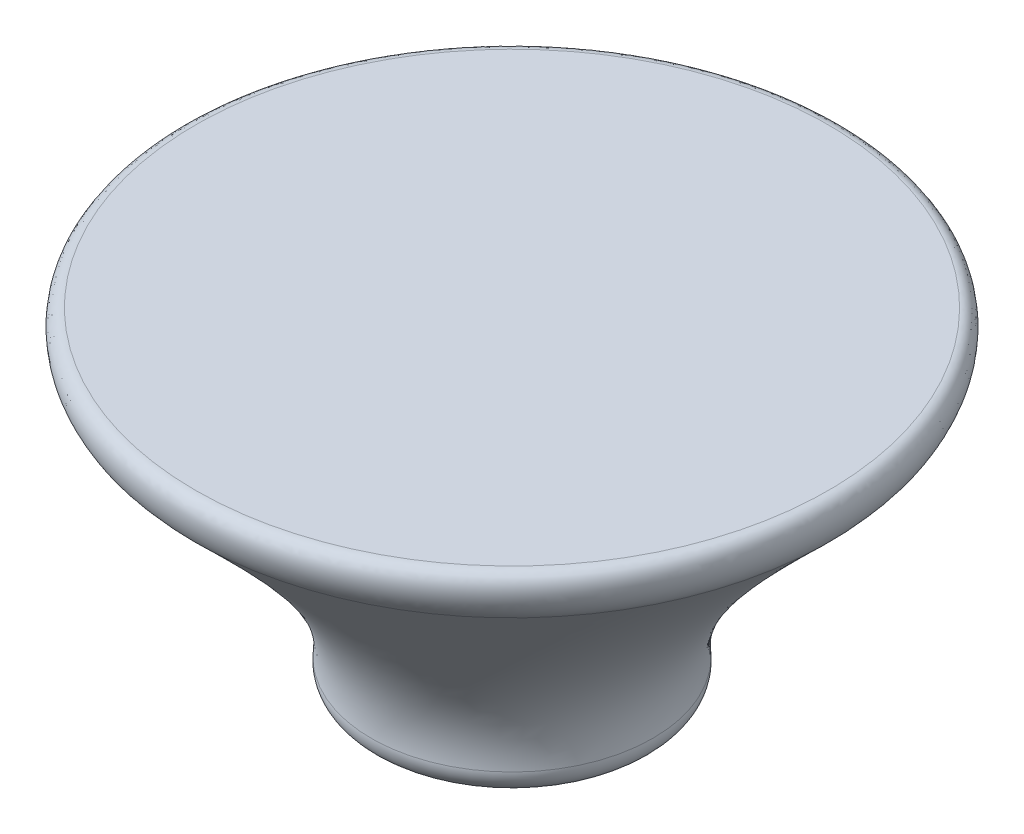
ISO-10303-21;
HEADER;
FILE_DESCRIPTION(('STEP AP214'),'2;1');
FILE_NAME('part.step','',(''),(''),'','','');
FILE_SCHEMA(('AUTOMOTIVE_DESIGN { 1 0 10303 214 1 1 1 1 }'));
ENDSEC;
DATA;
#1=APPLICATION_CONTEXT('core data for automotive mechanical design processes');
#2=APPLICATION_PROTOCOL_DEFINITION('international standard','automotive_design',2000,#1);
#3=PRODUCT_CONTEXT('',#1,'mechanical');
#4=PRODUCT('Part','Part','',(#3));
#5=PRODUCT_RELATED_PRODUCT_CATEGORY('part','',(#4));
#6=PRODUCT_DEFINITION_FORMATION('','',#4);
#7=PRODUCT_DEFINITION_CONTEXT('part definition',#1,'design');
#8=PRODUCT_DEFINITION('design','',#6,#7);
#9=PRODUCT_DEFINITION_SHAPE('','',#8);
#10=(LENGTH_UNIT() NAMED_UNIT(*) SI_UNIT(.MILLI.,.METRE.));
#11=(NAMED_UNIT(*) PLANE_ANGLE_UNIT() SI_UNIT($,.RADIAN.));
#12=(NAMED_UNIT(*) SI_UNIT($,.STERADIAN.) SOLID_ANGLE_UNIT());
#13=UNCERTAINTY_MEASURE_WITH_UNIT(LENGTH_MEASURE(1.E-05),#10,'distance_accuracy_value','');
#14=(GEOMETRIC_REPRESENTATION_CONTEXT(3) GLOBAL_UNCERTAINTY_ASSIGNED_CONTEXT((#13)) GLOBAL_UNIT_ASSIGNED_CONTEXT((#10,
#11,#12)) REPRESENTATION_CONTEXT('',''));
#15=CARTESIAN_POINT('',(0.,0.,0.));
#16=DIRECTION('',(0.,0.,1.));
#17=DIRECTION('',(1.,0.,0.));
#18=AXIS2_PLACEMENT_3D('',#15,#16,#17);
#19=CARTESIAN_POINT('',(0.,0.,0.));
#20=DIRECTION('',(0.,1.,0.));
#21=DIRECTION('',(0.,0.,1.));
#22=AXIS2_PLACEMENT_3D('',#19,#20,#21);
#23=PLANE('',#22);
#24=CARTESIAN_POINT('',(0.,0.,0.));
#25=DIRECTION('',(0.,1.,0.));
#26=DIRECTION('',(0.,0.,1.));
#27=AXIS2_PLACEMENT_3D('',#24,#25,#26);
#28=CIRCLE('',#27,5.46471682788271);
#29=CARTESIAN_POINT('',(0.,0.,5.46471682788271));
#30=VERTEX_POINT('',#29);
#31=EDGE_CURVE('E12',#30,#30,#28,.F.);
#32=ORIENTED_EDGE('',*,*,#31,.T.);
#33=EDGE_LOOP('',(#32));
#34=FACE_BOUND('',#33,.T.);
#35=CARTESIAN_POINT('',(0.,0.,0.));
#36=DIRECTION('',(0.,1.,0.));
#37=DIRECTION('',(0.,0.,1.));
#38=AXIS2_PLACEMENT_3D('',#35,#36,#37);
#39=CIRCLE('',#38,1.7);
#40=CARTESIAN_POINT('',(0.,0.,1.7));
#41=VERTEX_POINT('',#40);
#42=EDGE_CURVE('E161',#41,#41,#39,.T.);
#43=ORIENTED_EDGE('',*,*,#42,.T.);
#44=EDGE_LOOP('',(#43));
#45=FACE_BOUND('',#44,.T.);
#46=ADVANCED_FACE('F51',(#34,#45),#23,.F.);
#47=CARTESIAN_POINT('',(0.,15.,0.));
#48=DIRECTION('',(0.,1.,0.));
#49=DIRECTION('',(0.,0.,1.));
#50=AXIS2_PLACEMENT_3D('',#47,#48,#49);
#51=PLANE('',#50);
#52=CARTESIAN_POINT('',(0.,15.,14.5271494186596));
#53=CARTESIAN_POINT('',(-0.950799705315711,15.,14.5271494186588));
#54=CARTESIAN_POINT('',(-1.90157590247675,15.,14.4335061367227));
#55=CARTESIAN_POINT('',(-3.76663661364865,15.,14.0625224953567));
#56=CARTESIAN_POINT('',(-4.68087501475208,15.,13.7851913083565));
#57=CARTESIAN_POINT('',(-6.43772378927421,15.,13.0574807189092));
#58=CARTESIAN_POINT('',(-7.28029072527508,15.,12.6071193088302));
#59=CARTESIAN_POINT('',(-8.86141284999548,15.,11.5506472811578));
#60=CARTESIAN_POINT('',(-9.59992894606577,15.,10.9445627844222));
#61=CARTESIAN_POINT('',(-10.944562784423,15.,9.59992894606664));
#62=CARTESIAN_POINT('',(-11.5506472811545,15.,8.86141284999383));
#63=CARTESIAN_POINT('',(-12.6071193088335,15.,7.28029072527673));
#64=CARTESIAN_POINT('',(-13.0574807189091,15.,6.43772378927632));
#65=CARTESIAN_POINT('',(-13.7851913083565,15.,4.68087501475006));
#66=CARTESIAN_POINT('',(-14.0625224953542,15.,3.76663661364887));
#67=CARTESIAN_POINT('',(-14.4335061367251,15.,1.90157590247656));
#68=CARTESIAN_POINT('',(-14.5271494186588,15.,0.950799705321582));
#69=CARTESIAN_POINT('',(-14.5271494186604,15.,-0.950799705321645));
#70=CARTESIAN_POINT('',(-14.433506136726,15.,-1.90157590247984));
#71=CARTESIAN_POINT('',(-14.0625224953534,15.,-3.76663661364556));
#72=CARTESIAN_POINT('',(-13.7851913083565,15.,-4.68087501475455));
#73=CARTESIAN_POINT('',(-13.0574807189092,15.,-6.43772378927174));
#74=CARTESIAN_POINT('',(-12.6071193088311,15.,-7.2802907252792));
#75=CARTESIAN_POINT('',(-11.550647281157,15.,-8.86141284999135));
#76=CARTESIAN_POINT('',(-10.944562784423,15.,-9.59992894606498));
#77=CARTESIAN_POINT('',(-9.59992894606578,15.,-10.9445627844238));
#78=CARTESIAN_POINT('',(-8.86141284999384,15.,-11.5506472811578));
#79=CARTESIAN_POINT('',(-7.28029072527674,15.,-12.6071193088302));
#80=CARTESIAN_POINT('',(-6.43772378927549,15.,-13.0574807189083));
#81=CARTESIAN_POINT('',(-4.68087501475088,15.,-13.7851913083573));
#82=CARTESIAN_POINT('',(-3.76663661365012,15.,-14.0625224953558));
#83=CARTESIAN_POINT('',(-1.90157590247533,15.,-14.4335061367235));
#84=CARTESIAN_POINT('',(-0.950799705317287,15.,-14.5271494186612));
#85=CARTESIAN_POINT('',(0.950799705317283,15.,-14.5271494186579));
#86=CARTESIAN_POINT('',(1.90157590247675,15.,-14.4335061367227));
#87=CARTESIAN_POINT('',(3.76663661364865,15.,-14.0625224953567));
#88=CARTESIAN_POINT('',(4.68087501475252,15.,-13.785191308354));
#89=CARTESIAN_POINT('',(6.43772378927383,15.,-13.0574807189116));
#90=CARTESIAN_POINT('',(7.28029072527718,15.,-12.6071193088368));
#91=CARTESIAN_POINT('',(8.86141284999338,15.,-11.5506472811513));
#92=CARTESIAN_POINT('',(9.59992894606029,15.,-10.9445627844277));
#93=CARTESIAN_POINT('',(10.9445627844285,15.,-9.5999289460611));
#94=CARTESIAN_POINT('',(11.5506472811562,15.,-8.86141284999091));
#95=CARTESIAN_POINT('',(12.6071193088319,15.,-7.28029072527966));
#96=CARTESIAN_POINT('',(13.0574807189095,15.,-6.43772378927311));
#97=CARTESIAN_POINT('',(13.7851913083562,15.,-4.68087501475322));
#98=CARTESIAN_POINT('',(14.0625224953569,15.,-3.76663661364857));
#99=CARTESIAN_POINT('',(14.4335061367224,15.,-1.90157590247686));
#100=CARTESIAN_POINT('',(14.5271494186612,15.,-0.950799705316647));
#101=CARTESIAN_POINT('',(14.5271494186579,15.,0.950799705316648));
#102=CARTESIAN_POINT('',(14.4335061367224,15.,1.90157590247499));
#103=CARTESIAN_POINT('',(14.0625224953569,15.,3.76663661365041));
#104=CARTESIAN_POINT('',(13.785191308357,15.,4.68087501475404));
#105=CARTESIAN_POINT('',(13.0574807189086,15.,6.43772378927229));
#106=CARTESIAN_POINT('',(12.6071193088343,15.,7.28029072527883));
#107=CARTESIAN_POINT('',(11.5506472811537,15.,8.86141284999173));
#108=CARTESIAN_POINT('',(10.9445627844244,15.,9.5999289460644));
#109=CARTESIAN_POINT('',(9.5999289460644,15.,10.9445627844244));
#110=CARTESIAN_POINT('',(8.86141284999338,15.,11.5506472811554));
#111=CARTESIAN_POINT('',(7.28029072527718,15.,12.6071193088327));
#112=CARTESIAN_POINT('',(6.43772378927382,15.,13.0574807189083));
#113=CARTESIAN_POINT('',(4.68087501475251,15.,13.7851913083573));
#114=CARTESIAN_POINT('',(3.76663661364806,15.,14.062522495355));
#115=CARTESIAN_POINT('',(1.90157590247739,15.,14.4335061367243));
#116=CARTESIAN_POINT('',(0.950799705315712,15.,14.5271494186604));
#117=CARTESIAN_POINT('',(0.,15.,14.5271494186596));
#118=(BOUNDED_CURVE() B_SPLINE_CURVE(3,(#52,#53,#54,#55,#56,#57,#58,#59,#60,#61,#62,#63,#64,#65,
#66,#67,#68,#69,#70,#71,#72,#73,#74,#75,#76,#77,#78,#79,#80,#81,#82,#83,#84,#85,#86,#87,#88,#89,
#90,#91,#92,#93,#94,#95,#96,#97,#98,#99,#100,#101,#102,#103,#104,#105,#106,#107,#108,#109,#110,
#111,#112,#113,#114,#115,#116,#117),.UNSPECIFIED.,.T.,.F.) B_SPLINE_CURVE_WITH_KNOTS((4,2,2,2,2,
2,2,2,2,2,2,2,2,2,2,2,2,2,2,2,2,2,2,2,2,2,2,2,2,2,2,2,4),(-4.71238898038469,-4.51603943953533,
-4.31968989868597,-4.1233403578366,-3.92699081698724,-3.73064127613788,-3.53429173528852,
-3.33794219443916,-3.14159265358979,-2.94524311274043,-2.74889357189107,-2.55254403104171,
-2.35619449019234,-2.15984494934298,-1.96349540849362,-1.76714586764426,-1.5707963267949,
-1.37444678594553,-1.17809724509617,-0.98174770424681,-0.785398163397448,-0.589048622548086,
-0.392699081698724,-0.196349540849362,0.,0.196349540849362,0.392699081698724,0.589048622548086,
0.785398163397448,0.98174770424681,1.17809724509617,1.37444678594553,1.5707963267949),
.UNSPECIFIED.) CURVE() GEOMETRIC_REPRESENTATION_ITEM() RATIONAL_B_SPLINE_CURVE((1.,1.,1.,1.,1.,
1.,1.,1.,1.,1.,1.,1.,1.,1.,1.,1.,1.,1.,1.,1.,1.,1.,1.,1.,1.,1.,1.,1.,1.,1.,1.,1.,1.,1.,1.,1.,1.,
1.,1.,1.,1.,1.,1.,1.,1.,1.,1.,1.,1.,1.,1.,1.,1.,1.,1.,1.,1.,1.,1.,1.,1.,1.,1.,1.,1.,1.)) REPRESENTATION_ITEM(''));
#119=CARTESIAN_POINT('',(0.,15.,14.5271494186596));
#120=VERTEX_POINT('',#119);
#121=EDGE_CURVE('E68',#120,#120,#118,.F.);
#122=ORIENTED_EDGE('',*,*,#121,.T.);
#123=EDGE_LOOP('',(#122));
#124=FACE_BOUND('',#123,.T.);
#125=ADVANCED_FACE('F141',(#124),#51,.T.);
#126=CARTESIAN_POINT('',(-3.90873980544479,15.,-16.2361249420338));
#127=CARTESIAN_POINT('',(6.30065173641158,0.,-2.27854947202243));
#128=CARTESIAN_POINT('',(28.5635100786228,15.,-24.0536045529234));
#129=CARTESIAN_POINT('',(10.8577506804565,0.,10.3227540008007));
#130=CARTESIAN_POINT('',(36.3809896895123,15.,8.4186453311442));
#131=CARTESIAN_POINT('',(-1.74355279236672,0.,14.8798529448456));
#132=CARTESIAN_POINT('',(3.90873980544479,15.,16.2361249420338));
#133=CARTESIAN_POINT('',(-6.30065173641158,0.,2.27854947202243));
#134=CARTESIAN_POINT('',(-28.5635100786227,15.,24.0536045529233));
#135=CARTESIAN_POINT('',(-10.8577506804565,0.,-10.3227540008007));
#136=CARTESIAN_POINT('',(-36.3809896895123,15.,-8.41864533114418));
#137=CARTESIAN_POINT('',(1.74355279236671,0.,-14.8798529448456));
#138=CARTESIAN_POINT('',(-3.90873980544479,15.,-16.2361249420338));
#139=CARTESIAN_POINT('',(6.30065173641158,0.,-2.27854947202243));
#140=(BOUNDED_SURFACE() B_SPLINE_SURFACE(3,1,((#126,#127),(#128,#129),(#130,#131),(#132,#133),
(#134,#135),(#136,#137),(#138,#139)),.UNSPECIFIED.,.T.,.F.,.F.) B_SPLINE_SURFACE_WITH_KNOTS((4,
3,4),(2,2),(0.,0.5,1.),(0.,1.),
.UNSPECIFIED.) GEOMETRIC_REPRESENTATION_ITEM() RATIONAL_B_SPLINE_SURFACE(((1.,1.),
(0.333333333333333,0.333333333333333),(0.333333333333333,0.333333333333333),(1.,1.),
(0.333333333333334,0.333333333333333),(0.333333333333334,0.333333333333333),(1.,1.))) REPRESENTATION_ITEM('') SURFACE());
#141=CARTESIAN_POINT('',(0.,1.10722575308363,0.));
#142=DIRECTION('',(0.,-1.,0.));
#143=DIRECTION('',(1.,0.,0.));
#144=AXIS2_PLACEMENT_3D('',#141,#142,#143);
#145=CIRCLE('',#144,6.45895152747614);
#146=CARTESIAN_POINT('',(6.45895152747615,1.10722575308363,0.));
#147=VERTEX_POINT('',#146);
#148=EDGE_CURVE('E58',#147,#147,#145,.F.);
#149=CARTESIAN_POINT('',(-2.52302090832986,12.9640526693969,-14.3416657073764));
#150=CARTESIAN_POINT('',(26.160310506423,12.9640526693969,-19.3877075240362));
#151=CARTESIAN_POINT('',(31.2063523230827,12.9640526693969,9.2956238907167));
#152=CARTESIAN_POINT('',(2.52302090832986,12.9640526693969,14.3416657073764));
#153=CARTESIAN_POINT('',(-26.160310506423,12.9640526693969,19.3877075240362));
#154=CARTESIAN_POINT('',(-31.2063523230827,12.9640526693969,-9.29562389071668));
#155=CARTESIAN_POINT('',(-2.52302090832986,12.9640526693969,-14.3416657073764));
#156=(BOUNDED_CURVE() B_SPLINE_CURVE(3,(#149,#150,#151,#152,#153,#154,#155),.UNSPECIFIED.,.T.,
.F.) B_SPLINE_CURVE_WITH_KNOTS((4,3,4),(0.,0.5,1.),
.UNSPECIFIED.) CURVE() GEOMETRIC_REPRESENTATION_ITEM() RATIONAL_B_SPLINE_CURVE((1.,
0.333333333333333,0.333333333333333,1.,0.333333333333334,0.333333333333334,1.)) REPRESENTATION_ITEM(''));
#157=CARTESIAN_POINT('',(0.,12.9640526693969,14.5619026835784));
#158=VERTEX_POINT('',#157);
#159=EDGE_CURVE('E63',#158,#158,#156,.T.);
#160=ORIENTED_EDGE('',*,*,#148,.T.);
#161=EDGE_LOOP('',(#160));
#162=FACE_BOUND('',#161,.T.);
#163=ORIENTED_EDGE('',*,*,#159,.T.);
#164=EDGE_LOOP('',(#163));
#165=FACE_BOUND('',#164,.T.);
#166=ADVANCED_FACE('F90',(#162,#165),#140,.T.);
#167=CARTESIAN_POINT('',(0.,12.9640526693969,14.5619026835784));
#168=CARTESIAN_POINT('',(-0.953074301183853,12.9640526693961,14.5619026835775));
#169=CARTESIAN_POINT('',(-1.90612503797451,12.9640526693969,14.4680353790413));
#170=CARTESIAN_POINT('',(-3.77564752943912,12.964052669397,14.0961642343946));
#171=CARTESIAN_POINT('',(-4.69207306088981,12.9640526693972,13.8181695886564));
#172=CARTESIAN_POINT('',(-6.4531247405465,12.9640526693967,13.0887180989021));
#173=CARTESIAN_POINT('',(-7.29770734741943,12.9640526693945,12.6372792902957));
#174=CARTESIAN_POINT('',(-8.88261198682937,12.9640526693994,11.5782798671089));
#175=CARTESIAN_POINT('',(-9.62289483319579,12.9640526693967,10.9707454358775));
#176=CARTESIAN_POINT('',(-10.9707454358779,12.9640526693972,9.62289483319626));
#177=CARTESIAN_POINT('',(-11.578279867106,12.9640526693964,8.88261198682801));
#178=CARTESIAN_POINT('',(-12.6372792902986,12.9640526693975,7.29770734742079));
#179=CARTESIAN_POINT('',(-13.0887180989017,12.9640526693971,6.45312474054846));
#180=CARTESIAN_POINT('',(-13.8181695886567,12.9640526693968,4.69207306088794));
#181=CARTESIAN_POINT('',(-14.0961642343929,12.9640526693954,3.77564752943949));
#182=CARTESIAN_POINT('',(-14.468035379043,12.9640526693985,1.90612503797417));
#183=CARTESIAN_POINT('',(-14.5619026835775,12.9640526693961,0.953074301189737));
#184=CARTESIAN_POINT('',(-14.5619026835792,12.9640526693978,-0.9530743011898));
#185=CARTESIAN_POINT('',(-14.4680353790436,12.9640526693996,-1.9061250379774));
#186=CARTESIAN_POINT('',(-14.0961642343923,12.9640526693943,-3.77564752943624));
#187=CARTESIAN_POINT('',(-13.8181695886559,12.9640526693977,-4.69207306089211));
#188=CARTESIAN_POINT('',(-13.0887180989025,12.9640526693962,-6.45312474054421));
#189=CARTESIAN_POINT('',(-12.637279290296,12.9640526693968,-7.29770734742321));
#190=CARTESIAN_POINT('',(-11.5782798671086,12.9640526693971,-8.88261198682558));
#191=CARTESIAN_POINT('',(-10.9707454358783,12.9640526693967,-9.622894833195));
#192=CARTESIAN_POINT('',(-9.6228948331954,12.9640526693972,-10.9707454358787));
#193=CARTESIAN_POINT('',(-8.88261198682796,12.9640526693989,-11.5782798671092));
#194=CARTESIAN_POINT('',(-7.29770734742085,12.964052669395,-12.6372792902953));
#195=CARTESIAN_POINT('',(-6.45312474054815,12.9640526693974,-13.0887180989022));
#196=CARTESIAN_POINT('',(-4.69207306088824,12.9640526693965,-13.8181695886563));
#197=CARTESIAN_POINT('',(-3.77564752944064,12.9640526693967,-14.096164234394));
#198=CARTESIAN_POINT('',(-1.90612503797304,12.9640526693972,-14.4680353790419));
#199=CARTESIAN_POINT('',(-0.953074301185429,12.9640526693982,-14.5619026835796));
#200=CARTESIAN_POINT('',(0.953074301185425,12.9640526693957,-14.5619026835771));
#201=CARTESIAN_POINT('',(1.90612503797451,12.9640526693969,-14.4680353790413));
#202=CARTESIAN_POINT('',(3.77564752943912,12.964052669397,-14.0961642343946));
#203=CARTESIAN_POINT('',(4.69207306089096,12.9640526693969,-13.8181695886556));
#204=CARTESIAN_POINT('',(6.45312474054541,12.964052669397,-13.0887180989029));
#205=CARTESIAN_POINT('',(7.29770734742044,12.964052669399,-12.6372792903007));
#206=CARTESIAN_POINT('',(8.88261198682835,12.9640526693949,-11.5782798671039));
#207=CARTESIAN_POINT('',(9.62289483319002,12.9640526693963,-10.9707454358827));
#208=CARTESIAN_POINT('',(10.9707454358837,12.9640526693976,-9.62289483319102));
#209=CARTESIAN_POINT('',(11.5782798671081,12.9640526693966,-8.88261198682538));
#210=CARTESIAN_POINT('',(12.6372792902965,12.9640526693973,-7.29770734742343));
#211=CARTESIAN_POINT('',(13.0887180989025,12.9640526693966,-6.45312474054543));
#212=CARTESIAN_POINT('',(13.818169588656,12.9640526693973,-4.69207306089092));
#213=CARTESIAN_POINT('',(14.0961642343947,12.9640526693971,-3.77564752943902));
#214=CARTESIAN_POINT('',(14.4680353790412,12.9640526693968,-1.90612503797464));
#215=CARTESIAN_POINT('',(14.5619026835792,12.9640526693978,-0.953074301184787));
#216=CARTESIAN_POINT('',(14.5619026835775,12.9640526693961,0.953074301184787));
#217=CARTESIAN_POINT('',(14.4680353790405,12.9640526693958,1.90612503797265));
#218=CARTESIAN_POINT('',(14.0961642343954,12.964052669398,3.77564752944099));
#219=CARTESIAN_POINT('',(13.818169588656,12.9640526693974,4.69207306089139));
#220=CARTESIAN_POINT('',(13.0887180989025,12.9640526693965,6.45312474054496));
#221=CARTESIAN_POINT('',(12.637279290299,12.9640526693989,7.29770734742262));
#222=CARTESIAN_POINT('',(11.5782798671056,12.964052669395,8.88261198682617));
#223=CARTESIAN_POINT('',(10.9707454358797,12.9640526693973,9.62289483319452));
#224=CARTESIAN_POINT('',(9.62289483319393,12.9640526693965,10.9707454358792));
#225=CARTESIAN_POINT('',(8.88261198682743,12.9640526693966,11.5782798671067));
#226=CARTESIAN_POINT('',(7.29770734742136,12.9640526693973,12.6372792902979));
#227=CARTESIAN_POINT('',(6.45312474054612,12.9640526693959,13.0887180989013));
#228=CARTESIAN_POINT('',(4.69207306089023,12.964052669398,13.8181695886572));
#229=CARTESIAN_POINT('',(3.77564752943877,12.9640526693965,14.0961642343942));
#230=CARTESIAN_POINT('',(1.9061250379749,12.9640526693974,14.4680353790417));
#231=CARTESIAN_POINT('',(0.953074301183855,12.9640526693978,14.5619026835792));
#232=CARTESIAN_POINT('',(0.,12.9640526693969,14.5619026835784));
#233=CARTESIAN_POINT('',(0.,15.,16.6678018546242));
#234=CARTESIAN_POINT('',(-1.09090507954,14.9999999999984,16.6678018545236));
#235=CARTESIAN_POINT('',(-2.18178318679319,15.,16.560359738956));
#236=CARTESIAN_POINT('',(-4.32167047544587,15.,16.1347096924299));
#237=CARTESIAN_POINT('',(-5.37062674889211,15.,15.8165122856303));
#238=CARTESIAN_POINT('',(-7.38635649852538,15.,14.9815696852515));
#239=CARTESIAN_POINT('',(-8.35308013672726,14.9999999999967,14.4648451352133));
#240=CARTESIAN_POINT('',(-10.1671889838689,15.0000000000033,13.2526963567866));
#241=CARTESIAN_POINT('',(-11.0145293395374,15.,12.5573020982184));
#242=CARTESIAN_POINT('',(-12.5573020982192,15.,11.0145293395383));
#243=CARTESIAN_POINT('',(-13.2526963567197,14.9999999999983,10.1671889838598));
#244=CARTESIAN_POINT('',(-14.46484513528,15.0000000000016,8.35308013673638));
#245=CARTESIAN_POINT('',(-14.9815696852878,15.,7.38635649856366));
#246=CARTESIAN_POINT('',(-15.8165122855939,15.,5.37062674885369));
#247=CARTESIAN_POINT('',(-16.1347096923887,14.9999999999983,4.32167047541278));
#248=CARTESIAN_POINT('',(-16.5603597389973,15.0000000000016,2.18178318682649));
#249=CARTESIAN_POINT('',(-16.6678018546208,14.9999999999983,1.09090507942343));
#250=CARTESIAN_POINT('',(-16.6678018546274,15.0000000000016,-1.09090507942325));
#251=CARTESIAN_POINT('',(-16.5603597389727,15.0000000000033,-2.18178318677259));
#252=CARTESIAN_POINT('',(-16.1347096924136,14.9999999999967,-4.3216704754665));
#253=CARTESIAN_POINT('',(-15.8165122856847,15.,-5.37062674883978));
#254=CARTESIAN_POINT('',(-14.9815696851971,15.,-7.38635649857779));
#255=CARTESIAN_POINT('',(-14.4648451352554,15.,-8.35308013675859));
#256=CARTESIAN_POINT('',(-13.2526963567445,15.,-10.1671889838375));
#257=CARTESIAN_POINT('',(-12.5573020982192,15.,-11.0145293395365));
#258=CARTESIAN_POINT('',(-11.0145293395374,15.,-12.55730209822));
#259=CARTESIAN_POINT('',(-10.1671889839151,15.0000000000041,-13.2526963568072));
#260=CARTESIAN_POINT('',(-8.35308013668118,14.9999999999959,-14.4648451351928));
#261=CARTESIAN_POINT('',(-7.38635649850931,15.0000000000033,-14.9815696852606));
#262=CARTESIAN_POINT('',(-5.37062674890819,14.9999999999967,-15.8165122856212));
#263=CARTESIAN_POINT('',(-4.32167047540006,15.,-16.1347096924481));
#264=CARTESIAN_POINT('',(-2.18178318683933,15.,-16.5603597389379));
#265=CARTESIAN_POINT('',(-1.09090507950867,15.,-16.6678018546241));
#266=CARTESIAN_POINT('',(1.09090507950867,15.,-16.6678018546241));
#267=CARTESIAN_POINT('',(2.18178318679282,15.,-16.5603597389561));
#268=CARTESIAN_POINT('',(4.32167047544632,15.,-16.13470969243));
#269=CARTESIAN_POINT('',(5.37062674887478,15.0000000000033,-15.8165122857103));
#270=CARTESIAN_POINT('',(7.38635649854269,14.9999999999967,-14.9815696851716));
#271=CARTESIAN_POINT('',(8.35308013673779,15.0000000000033,-14.4648451353089));
#272=CARTESIAN_POINT('',(10.1671889838583,14.9999999999967,-13.2526963566911));
#273=CARTESIAN_POINT('',(11.0145293395321,14.9999999999983,-12.5573020981718));
#274=CARTESIAN_POINT('',(12.5573020982246,15.0000000000016,-11.0145293395849));
#275=CARTESIAN_POINT('',(13.2526963567249,14.9999999999992,-10.1671889837892));
#276=CARTESIAN_POINT('',(14.4648451352751,15.0000000000008,-8.35308013680717));
#277=CARTESIAN_POINT('',(14.9815696852337,15.,-7.38635649854274));
#278=CARTESIAN_POINT('',(15.8165122856481,15.,-5.3706267488748));
#279=CARTESIAN_POINT('',(16.1347096923972,15.,-4.32167047539046));
#280=CARTESIAN_POINT('',(16.5603597389888,15.,-2.18178318684882));
#281=CARTESIAN_POINT('',(16.6678018546768,15.0000000000008,-1.09090507954521));
#282=CARTESIAN_POINT('',(16.6678018545712,14.9999999999992,1.09090507954513));
#283=CARTESIAN_POINT('',(16.5603597388898,14.9999999999967,2.1817831868295));
#284=CARTESIAN_POINT('',(16.1347096924961,15.0000000000033,4.3216704754099));
#285=CARTESIAN_POINT('',(15.8165122856036,14.9999999999983,5.37062674885707));
#286=CARTESIAN_POINT('',(14.9815696852783,15.0000000000016,7.38635649856047));
#287=CARTESIAN_POINT('',(14.464845135299,15.0000000000033,8.35308013678655));
#288=CARTESIAN_POINT('',(13.252696356701,14.9999999999967,10.1671889838098));
#289=CARTESIAN_POINT('',(12.5573020981694,15.0000000000008,11.0145293395369));
#290=CARTESIAN_POINT('',(11.0145293395874,14.9999999999992,12.5573020982195));
#291=CARTESIAN_POINT('',(10.1671889838122,14.9999999999984,13.2526963567027));
#292=CARTESIAN_POINT('',(8.35308013678404,15.0000000000017,14.4648451352974));
#293=CARTESIAN_POINT('',(7.38635649861484,15.,14.9815696852408));
#294=CARTESIAN_POINT('',(5.37062674880261,15.,15.816512285641));
#295=CARTESIAN_POINT('',(4.32167047545521,15.0000000000016,16.1347096924762));
#296=CARTESIAN_POINT('',(2.18178318678398,14.9999999999983,16.5603597389099));
#297=CARTESIAN_POINT('',(1.09090507954002,15.0000000000017,16.6678018547248));
#298=CARTESIAN_POINT('',(0.,15.,16.6678018546242));
#299=CARTESIAN_POINT('',(0.,15.,14.5271494186596));
#300=CARTESIAN_POINT('',(-0.950799705315711,15.,14.5271494186588));
#301=CARTESIAN_POINT('',(-1.90157590247675,15.,14.4335061367227));
#302=CARTESIAN_POINT('',(-3.76663661364865,15.,14.0625224953567));
#303=CARTESIAN_POINT('',(-4.68087501475208,15.,13.7851913083565));
#304=CARTESIAN_POINT('',(-6.43772378927421,15.,13.0574807189092));
#305=CARTESIAN_POINT('',(-7.28029072527508,15.,12.6071193088302));
#306=CARTESIAN_POINT('',(-8.86141284999548,15.,11.5506472811578));
#307=CARTESIAN_POINT('',(-9.59992894606577,15.,10.9445627844222));
#308=CARTESIAN_POINT('',(-10.944562784423,15.,9.59992894606664));
#309=CARTESIAN_POINT('',(-11.5506472811545,15.,8.86141284999383));
#310=CARTESIAN_POINT('',(-12.6071193088335,15.,7.28029072527673));
#311=CARTESIAN_POINT('',(-13.0574807189091,15.,6.43772378927632));
#312=CARTESIAN_POINT('',(-13.7851913083565,15.,4.68087501475006));
#313=CARTESIAN_POINT('',(-14.0625224953542,15.,3.76663661364887));
#314=CARTESIAN_POINT('',(-14.4335061367251,15.,1.90157590247656));
#315=CARTESIAN_POINT('',(-14.5271494186588,15.,0.950799705321582));
#316=CARTESIAN_POINT('',(-14.5271494186604,15.,-0.950799705321645));
#317=CARTESIAN_POINT('',(-14.433506136726,15.,-1.90157590247984));
#318=CARTESIAN_POINT('',(-14.0625224953534,15.,-3.76663661364556));
#319=CARTESIAN_POINT('',(-13.7851913083565,15.,-4.68087501475455));
#320=CARTESIAN_POINT('',(-13.0574807189092,15.,-6.43772378927174));
#321=CARTESIAN_POINT('',(-12.6071193088311,15.,-7.2802907252792));
#322=CARTESIAN_POINT('',(-11.550647281157,15.,-8.86141284999135));
#323=CARTESIAN_POINT('',(-10.944562784423,15.,-9.59992894606498));
#324=CARTESIAN_POINT('',(-9.59992894606578,15.,-10.9445627844238));
#325=CARTESIAN_POINT('',(-8.86141284999384,15.,-11.5506472811578));
#326=CARTESIAN_POINT('',(-7.28029072527674,15.,-12.6071193088302));
#327=CARTESIAN_POINT('',(-6.43772378927549,15.,-13.0574807189083));
#328=CARTESIAN_POINT('',(-4.68087501475088,15.,-13.7851913083573));
#329=CARTESIAN_POINT('',(-3.76663661365012,15.,-14.0625224953558));
#330=CARTESIAN_POINT('',(-1.90157590247533,15.,-14.4335061367235));
#331=CARTESIAN_POINT('',(-0.950799705317287,15.,-14.5271494186612));
#332=CARTESIAN_POINT('',(0.950799705317283,15.,-14.5271494186579));
#333=CARTESIAN_POINT('',(1.90157590247675,15.,-14.4335061367227));
#334=CARTESIAN_POINT('',(3.76663661364865,15.,-14.0625224953567));
#335=CARTESIAN_POINT('',(4.68087501475252,15.,-13.785191308354));
#336=CARTESIAN_POINT('',(6.43772378927383,15.,-13.0574807189116));
#337=CARTESIAN_POINT('',(7.28029072527718,15.,-12.6071193088368));
#338=CARTESIAN_POINT('',(8.86141284999338,15.,-11.5506472811513));
#339=CARTESIAN_POINT('',(9.59992894606029,15.,-10.9445627844277));
#340=CARTESIAN_POINT('',(10.9445627844285,15.,-9.5999289460611));
#341=CARTESIAN_POINT('',(11.5506472811562,15.,-8.86141284999091));
#342=CARTESIAN_POINT('',(12.6071193088319,15.,-7.28029072527966));
#343=CARTESIAN_POINT('',(13.0574807189095,15.,-6.43772378927311));
#344=CARTESIAN_POINT('',(13.7851913083562,15.,-4.68087501475322));
#345=CARTESIAN_POINT('',(14.0625224953569,15.,-3.76663661364857));
#346=CARTESIAN_POINT('',(14.4335061367224,15.,-1.90157590247686));
#347=CARTESIAN_POINT('',(14.5271494186612,15.,-0.950799705316647));
#348=CARTESIAN_POINT('',(14.5271494186579,15.,0.950799705316648));
#349=CARTESIAN_POINT('',(14.4335061367224,15.,1.90157590247499));
#350=CARTESIAN_POINT('',(14.0625224953569,15.,3.76663661365041));
#351=CARTESIAN_POINT('',(13.785191308357,15.,4.68087501475404));
#352=CARTESIAN_POINT('',(13.0574807189086,15.,6.43772378927229));
#353=CARTESIAN_POINT('',(12.6071193088343,15.,7.28029072527883));
#354=CARTESIAN_POINT('',(11.5506472811537,15.,8.86141284999173));
#355=CARTESIAN_POINT('',(10.9445627844244,15.,9.5999289460644));
#356=CARTESIAN_POINT('',(9.5999289460644,15.,10.9445627844244));
#357=CARTESIAN_POINT('',(8.86141284999338,15.,11.5506472811554));
#358=CARTESIAN_POINT('',(7.28029072527718,15.,12.6071193088327));
#359=CARTESIAN_POINT('',(6.43772378927382,15.,13.0574807189083));
#360=CARTESIAN_POINT('',(4.68087501475251,15.,13.7851913083573));
#361=CARTESIAN_POINT('',(3.76663661364806,15.,14.062522495355));
#362=CARTESIAN_POINT('',(1.90157590247739,15.,14.4335061367243));
#363=CARTESIAN_POINT('',(0.950799705315712,15.,14.5271494186604));
#364=CARTESIAN_POINT('',(0.,15.,14.5271494186596));
#365=(BOUNDED_SURFACE() B_SPLINE_SURFACE(2,3,((#167,#168,#169,#170,#171,#172,#173,#174,#175,
#176,#177,#178,#179,#180,#181,#182,#183,#184,#185,#186,#187,#188,#189,#190,#191,#192,#193,#194,
#195,#196,#197,#198,#199,#200,#201,#202,#203,#204,#205,#206,#207,#208,#209,#210,#211,#212,#213,
#214,#215,#216,#217,#218,#219,#220,#221,#222,#223,#224,#225,#226,#227,#228,#229,#230,#231,#232),
(#233,#234,#235,#236,#237,#238,#239,#240,#241,#242,#243,#244,#245,#246,#247,#248,#249,#250,#251,
#252,#253,#254,#255,#256,#257,#258,#259,#260,#261,#262,#263,#264,#265,#266,#267,#268,#269,#270,
#271,#272,#273,#274,#275,#276,#277,#278,#279,#280,#281,#282,#283,#284,#285,#286,#287,#288,#289,
#290,#291,#292,#293,#294,#295,#296,#297,#298),(#299,#300,#301,#302,#303,#304,#305,#306,#307,
#308,#309,#310,#311,#312,#313,#314,#315,#316,#317,#318,#319,#320,#321,#322,#323,#324,#325,#326,
#327,#328,#329,#330,#331,#332,#333,#334,#335,#336,#337,#338,#339,#340,#341,#342,#343,#344,#345,
#346,#347,#348,#349,#350,#351,#352,#353,#354,#355,#356,#357,#358,#359,#360,#361,#362,#363,
#364)),.UNSPECIFIED.,.F.,.T.,.F.) B_SPLINE_SURFACE_WITH_KNOTS((3,3),(4,2,2,2,2,2,2,2,2,2,2,2,2,
2,2,2,2,2,2,2,2,2,2,2,2,2,2,2,2,2,2,2,4),(0.,1.),(-4.71238898038469,-4.51603943953533,
-4.31968989868597,-4.1233403578366,-3.92699081698724,-3.73064127613788,-3.53429173528852,
-3.33794219443916,-3.14159265358979,-2.94524311274043,-2.74889357189107,-2.55254403104171,
-2.35619449019234,-2.15984494934298,-1.96349540849362,-1.76714586764426,-1.5707963267949,
-1.37444678594553,-1.17809724509617,-0.98174770424681,-0.785398163397448,-0.589048622548086,
-0.392699081698724,-0.196349540849362,0.,0.196349540849362,0.392699081698724,0.589048622548086,
0.785398163397448,0.98174770424681,1.17809724509617,1.37444678594553,1.5707963267949),
.UNSPECIFIED.) GEOMETRIC_REPRESENTATION_ITEM() RATIONAL_B_SPLINE_SURFACE(((1.,1.,1.,1.,1.,1.,1.,
1.,1.,1.,1.,1.,1.,1.,1.,1.,1.,1.,1.,1.,1.,1.,1.,1.,1.,1.,1.,1.,1.,1.,1.,1.,1.,1.,1.,1.,1.,1.,1.,
1.,1.,1.,1.,1.,1.,1.,1.,1.,1.,1.,1.,1.,1.,1.,1.,1.,1.,1.,1.,1.,1.,1.,1.,1.,1.,1.),
(0.374868902377173,0.374868902377173,0.374868902377191,0.374868902377191,0.374868902377182,
0.374868902377182,0.374868902377184,0.374868902377184,0.374868902377196,0.374868902377196,
0.374868902377191,0.374868902377191,0.374868902377191,0.374868902377191,0.374868902377181,
0.374868902377181,0.374868902377184,0.374868902377184,0.374868902377167,0.374868902377167,
0.374868902377184,0.374868902377184,0.374868902377184,0.374868902377184,0.374868902377205,
0.374868902377205,0.374868902377175,0.374868902377175,0.374868902377182,0.374868902377182,
0.374868902377182,0.374868902377182,0.374868902377184,0.374868902377184,0.374868902377179,
0.374868902377179,0.37486890237718,0.37486890237718,0.374868902377184,0.374868902377184,
0.374868902377196,0.374868902377196,0.374868902377174,0.374868902377174,0.374868902377182,
0.374868902377182,0.374868902377181,0.374868902377181,0.374868902377196,0.374868902377196,
0.374868902377182,0.374868902377182,0.374868902377182,0.374868902377182,0.374868902377174,
0.374868902377174,0.374868902377196,0.374868902377196,0.374868902377173,0.374868902377173,
0.37486890237718,0.37486890237718,0.374868902377179,0.374868902377179,0.374868902377173,
0.374868902377173),(1.,1.,1.,1.,1.,1.,1.,1.,1.,1.,1.,1.,1.,1.,1.,1.,1.,1.,1.,1.,1.,1.,1.,1.,1.,
1.,1.,1.,1.,1.,1.,1.,1.,1.,1.,1.,1.,1.,1.,1.,1.,1.,1.,1.,1.,1.,1.,1.,1.,1.,1.,1.,1.,1.,1.,1.,1.,
1.,1.,1.,1.,1.,1.,1.,1.,1.))) REPRESENTATION_ITEM('') SURFACE());
#366=ORIENTED_EDGE('',*,*,#159,.F.);
#367=EDGE_LOOP('',(#366));
#368=FACE_BOUND('',#367,.T.);
#369=ORIENTED_EDGE('',*,*,#121,.F.);
#370=EDGE_LOOP('',(#369));
#371=FACE_BOUND('',#370,.T.);
#372=ADVANCED_FACE('F76',(#368,#371),#365,.T.);
#373=CARTESIAN_POINT('',(0.,10.,0.));
#374=DIRECTION('',(0.,-1.,0.));
#375=DIRECTION('',(0.,0.,-1.));
#376=AXIS2_PLACEMENT_3D('',#373,#374,#375);
#377=CYLINDRICAL_SURFACE('',#376,1.7);
#378=CARTESIAN_POINT('',(0.,10.,0.));
#379=DIRECTION('',(0.,1.,0.));
#380=DIRECTION('',(0.,0.,1.));
#381=AXIS2_PLACEMENT_3D('',#378,#379,#380);
#382=CIRCLE('',#381,1.7);
#383=CARTESIAN_POINT('',(0.,10.,1.7));
#384=VERTEX_POINT('',#383);
#385=EDGE_CURVE('E165',#384,#384,#382,.T.);
#386=ORIENTED_EDGE('',*,*,#385,.T.);
#387=EDGE_LOOP('',(#386));
#388=FACE_BOUND('',#387,.T.);
#389=ORIENTED_EDGE('',*,*,#42,.F.);
#390=EDGE_LOOP('',(#389));
#391=FACE_BOUND('',#390,.T.);
#392=ADVANCED_FACE('F89',(#388,#391),#377,.F.);
#393=CARTESIAN_POINT('',(0.,10.,0.));
#394=DIRECTION('',(0.,1.,0.));
#395=DIRECTION('',(0.,0.,1.));
#396=AXIS2_PLACEMENT_3D('',#393,#394,#395);
#397=PLANE('',#396);
#398=ORIENTED_EDGE('',*,*,#385,.F.);
#399=EDGE_LOOP('',(#398));
#400=FACE_BOUND('',#399,.T.);
#401=ADVANCED_FACE('F173',(#400),#397,.F.);
#402=CARTESIAN_POINT('',(0.,1.,0.));
#403=DIRECTION('',(0.,-1.,0.));
#404=DIRECTION('',(1.,0.,0.));
#405=AXIS2_PLACEMENT_3D('',#402,#403,#404);
#406=TOROIDAL_SURFACE('',#405,5.46471682788271,1.);
#407=ORIENTED_EDGE('',*,*,#31,.F.);
#408=EDGE_LOOP('',(#407));
#409=FACE_BOUND('',#408,.T.);
#410=ORIENTED_EDGE('',*,*,#148,.F.);
#411=EDGE_LOOP('',(#410));
#412=FACE_BOUND('',#411,.T.);
#413=ADVANCED_FACE('F53',(#409,#412),#406,.T.);
#414=CLOSED_SHELL('',(#46,#125,#166,#372,#392,#401,#413));
#415=MANIFOLD_SOLID_BREP('B2',#414);
#416=ADVANCED_BREP_SHAPE_REPRESENTATION('',(#18,#415),#14);
#417=SHAPE_DEFINITION_REPRESENTATION(#9,#416);
ENDSEC;
END-ISO-10303-21;
